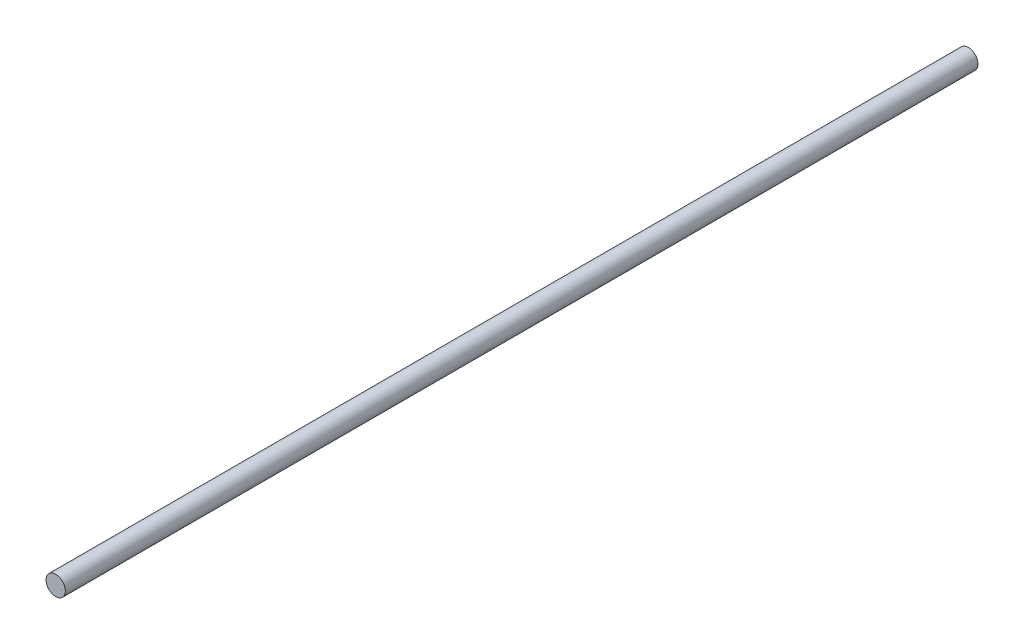
ISO-10303-21;
HEADER;
FILE_DESCRIPTION(('STEP AP214'),'2;1');
FILE_NAME('part.step','',(''),(''),'','','');
FILE_SCHEMA(('AUTOMOTIVE_DESIGN { 1 0 10303 214 1 1 1 1 }'));
ENDSEC;
DATA;
#1=APPLICATION_CONTEXT('core data for automotive mechanical design processes');
#2=APPLICATION_PROTOCOL_DEFINITION('international standard','automotive_design',2000,#1);
#3=PRODUCT_CONTEXT('',#1,'mechanical');
#4=PRODUCT('Part','Part','',(#3));
#5=PRODUCT_RELATED_PRODUCT_CATEGORY('part','',(#4));
#6=PRODUCT_DEFINITION_FORMATION('','',#4);
#7=PRODUCT_DEFINITION_CONTEXT('part definition',#1,'design');
#8=PRODUCT_DEFINITION('design','',#6,#7);
#9=PRODUCT_DEFINITION_SHAPE('','',#8);
#10=(LENGTH_UNIT() NAMED_UNIT(*) SI_UNIT(.MILLI.,.METRE.));
#11=(NAMED_UNIT(*) PLANE_ANGLE_UNIT() SI_UNIT($,.RADIAN.));
#12=(NAMED_UNIT(*) SI_UNIT($,.STERADIAN.) SOLID_ANGLE_UNIT());
#13=UNCERTAINTY_MEASURE_WITH_UNIT(LENGTH_MEASURE(1.E-05),#10,'distance_accuracy_value','');
#14=(GEOMETRIC_REPRESENTATION_CONTEXT(3) GLOBAL_UNCERTAINTY_ASSIGNED_CONTEXT((#13)) GLOBAL_UNIT_ASSIGNED_CONTEXT((#10,
#11,#12)) REPRESENTATION_CONTEXT('',''));
#15=CARTESIAN_POINT('',(0.,0.,0.));
#16=DIRECTION('',(0.,0.,1.));
#17=DIRECTION('',(1.,0.,0.));
#18=AXIS2_PLACEMENT_3D('',#15,#16,#17);
#19=CARTESIAN_POINT('',(0.,0.,282.5));
#20=DIRECTION('',(0.,0.,-1.));
#21=DIRECTION('',(-1.,0.,0.));
#22=AXIS2_PLACEMENT_3D('',#19,#20,#21);
#23=CYLINDRICAL_SURFACE('',#22,6.);
#24=CARTESIAN_POINT('',(0.,0.,282.5));
#25=DIRECTION('',(0.,0.,1.));
#26=DIRECTION('',(1.,0.,0.));
#27=AXIS2_PLACEMENT_3D('',#24,#25,#26);
#28=CIRCLE('',#27,6.);
#29=CARTESIAN_POINT('',(6.,0.,282.5));
#30=VERTEX_POINT('',#29);
#31=EDGE_CURVE('E10',#30,#30,#28,.T.);
#32=ORIENTED_EDGE('',*,*,#31,.F.);
#33=EDGE_LOOP('',(#32));
#34=FACE_BOUND('',#33,.T.);
#35=CARTESIAN_POINT('',(0.,0.,-282.5));
#36=DIRECTION('',(0.,0.,1.));
#37=DIRECTION('',(1.,0.,0.));
#38=AXIS2_PLACEMENT_3D('',#35,#36,#37);
#39=CIRCLE('',#38,6.);
#40=CARTESIAN_POINT('',(6.,0.,-282.5));
#41=VERTEX_POINT('',#40);
#42=EDGE_CURVE('E40',#41,#41,#39,.T.);
#43=ORIENTED_EDGE('',*,*,#42,.T.);
#44=EDGE_LOOP('',(#43));
#45=FACE_BOUND('',#44,.T.);
#46=ADVANCED_FACE('F37',(#34,#45),#23,.T.);
#47=CARTESIAN_POINT('',(0.,0.,282.5));
#48=DIRECTION('',(0.,0.,1.));
#49=DIRECTION('',(1.,0.,0.));
#50=AXIS2_PLACEMENT_3D('',#47,#48,#49);
#51=PLANE('',#50);
#52=ORIENTED_EDGE('',*,*,#31,.T.);
#53=EDGE_LOOP('',(#52));
#54=FACE_BOUND('',#53,.T.);
#55=ADVANCED_FACE('F54',(#54),#51,.T.);
#56=CARTESIAN_POINT('',(0.,0.,-282.5));
#57=DIRECTION('',(0.,0.,1.));
#58=DIRECTION('',(1.,0.,0.));
#59=AXIS2_PLACEMENT_3D('',#56,#57,#58);
#60=PLANE('',#59);
#61=ORIENTED_EDGE('',*,*,#42,.F.);
#62=EDGE_LOOP('',(#61));
#63=FACE_BOUND('',#62,.T.);
#64=ADVANCED_FACE('F52',(#63),#60,.F.);
#65=CLOSED_SHELL('',(#46,#55,#64));
#66=MANIFOLD_SOLID_BREP('B2',#65);
#67=ADVANCED_BREP_SHAPE_REPRESENTATION('',(#18,#66),#14);
#68=SHAPE_DEFINITION_REPRESENTATION(#9,#67);
ENDSEC;
END-ISO-10303-21;
